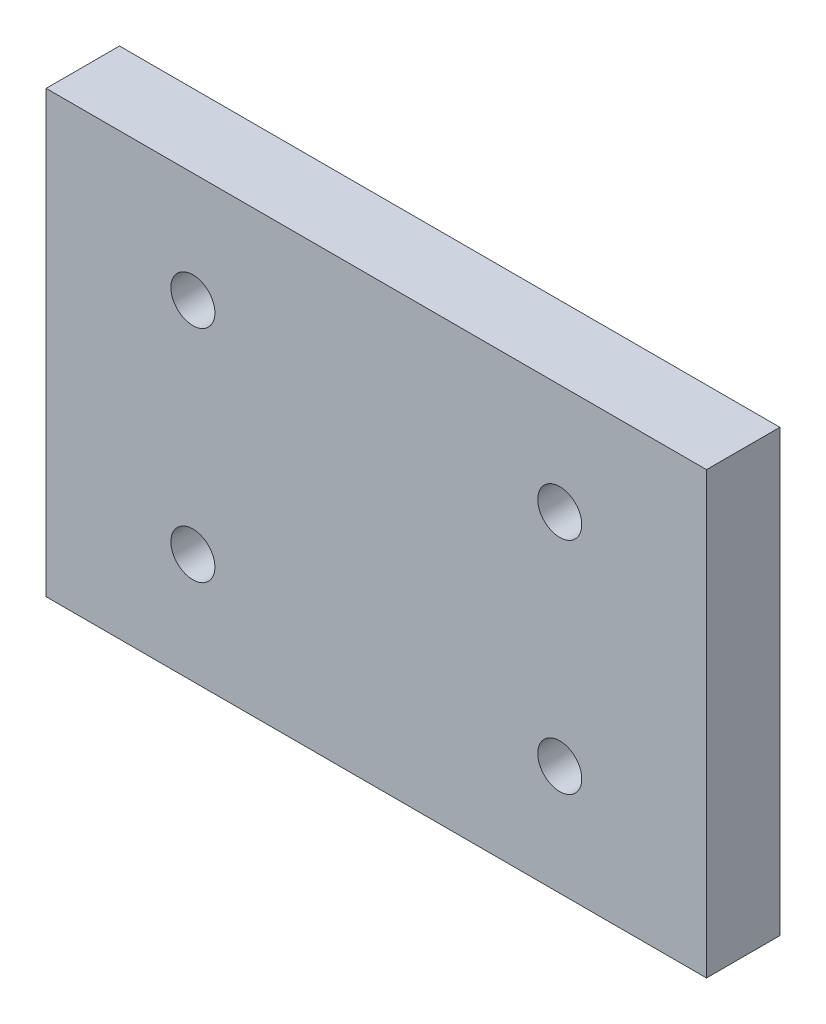
ISO-10303-21;
HEADER;
FILE_DESCRIPTION(('STEP AP214'),'2;1');
FILE_NAME('part.step','',(''),(''),'','','');
FILE_SCHEMA(('AUTOMOTIVE_DESIGN { 1 0 10303 214 1 1 1 1 }'));
ENDSEC;
DATA;
#1=APPLICATION_CONTEXT('core data for automotive mechanical design processes');
#2=APPLICATION_PROTOCOL_DEFINITION('international standard','automotive_design',2000,#1);
#3=PRODUCT_CONTEXT('',#1,'mechanical');
#4=PRODUCT('Part','Part','',(#3));
#5=PRODUCT_RELATED_PRODUCT_CATEGORY('part','',(#4));
#6=PRODUCT_DEFINITION_FORMATION('','',#4);
#7=PRODUCT_DEFINITION_CONTEXT('part definition',#1,'design');
#8=PRODUCT_DEFINITION('design','',#6,#7);
#9=PRODUCT_DEFINITION_SHAPE('','',#8);
#10=(LENGTH_UNIT() NAMED_UNIT(*) SI_UNIT(.MILLI.,.METRE.));
#11=(NAMED_UNIT(*) PLANE_ANGLE_UNIT() SI_UNIT($,.RADIAN.));
#12=(NAMED_UNIT(*) SI_UNIT($,.STERADIAN.) SOLID_ANGLE_UNIT());
#13=UNCERTAINTY_MEASURE_WITH_UNIT(LENGTH_MEASURE(1.E-05),#10,'distance_accuracy_value','');
#14=(GEOMETRIC_REPRESENTATION_CONTEXT(3) GLOBAL_UNCERTAINTY_ASSIGNED_CONTEXT((#13)) GLOBAL_UNIT_ASSIGNED_CONTEXT((#10,
#11,#12)) REPRESENTATION_CONTEXT('',''));
#15=CARTESIAN_POINT('',(0.,0.,0.));
#16=DIRECTION('',(0.,0.,1.));
#17=DIRECTION('',(1.,0.,0.));
#18=AXIS2_PLACEMENT_3D('',#15,#16,#17);
#19=CARTESIAN_POINT('',(90.,0.,20.));
#20=DIRECTION('',(0.,1.,0.));
#21=DIRECTION('',(-1.,0.,0.));
#22=AXIS2_PLACEMENT_3D('',#19,#20,#21);
#23=PLANE('',#22);
#24=DIRECTION('',(1.,0.,0.));
#25=VECTOR('',#24,1.);
#26=CARTESIAN_POINT('',(90.,0.,0.));
#27=LINE('',#26,#25);
#28=CARTESIAN_POINT('',(-90.,0.,0.));
#29=VERTEX_POINT('',#28);
#30=CARTESIAN_POINT('',(90.,0.,0.));
#31=VERTEX_POINT('',#30);
#32=EDGE_CURVE('E103',#29,#31,#27,.T.);
#33=ORIENTED_EDGE('',*,*,#32,.T.);
#34=DIRECTION('',(0.,0.,-1.));
#35=VECTOR('',#34,1.);
#36=CARTESIAN_POINT('',(90.,0.,20.));
#37=LINE('',#36,#35);
#38=CARTESIAN_POINT('',(90.,0.,20.));
#39=VERTEX_POINT('',#38);
#40=EDGE_CURVE('E11',#39,#31,#37,.T.);
#41=ORIENTED_EDGE('',*,*,#40,.F.);
#42=DIRECTION('',(1.,0.,0.));
#43=VECTOR('',#42,1.);
#44=CARTESIAN_POINT('',(90.,0.,20.));
#45=LINE('',#44,#43);
#46=CARTESIAN_POINT('',(-90.,0.,20.));
#47=VERTEX_POINT('',#46);
#48=EDGE_CURVE('E90',#47,#39,#45,.T.);
#49=ORIENTED_EDGE('',*,*,#48,.F.);
#50=DIRECTION('',(0.,0.,-1.));
#51=VECTOR('',#50,1.);
#52=CARTESIAN_POINT('',(-90.,0.,20.));
#53=LINE('',#52,#51);
#54=EDGE_CURVE('E99',#47,#29,#53,.T.);
#55=ORIENTED_EDGE('',*,*,#54,.T.);
#56=EDGE_LOOP('',(#33,#41,#49,#55));
#57=FACE_BOUND('',#56,.T.);
#58=ADVANCED_FACE('F37',(#57),#23,.F.);
#59=CARTESIAN_POINT('',(90.,120.,20.));
#60=DIRECTION('',(-1.,0.,0.));
#61=DIRECTION('',(0.,-1.,0.));
#62=AXIS2_PLACEMENT_3D('',#59,#60,#61);
#63=PLANE('',#62);
#64=DIRECTION('',(0.,1.,0.));
#65=VECTOR('',#64,1.);
#66=CARTESIAN_POINT('',(90.,120.,0.));
#67=LINE('',#66,#65);
#68=CARTESIAN_POINT('',(90.,120.,0.));
#69=VERTEX_POINT('',#68);
#70=EDGE_CURVE('E94',#31,#69,#67,.T.);
#71=ORIENTED_EDGE('',*,*,#70,.T.);
#72=DIRECTION('',(0.,0.,-1.));
#73=VECTOR('',#72,1.);
#74=CARTESIAN_POINT('',(90.,120.,20.));
#75=LINE('',#74,#73);
#76=CARTESIAN_POINT('',(90.,120.,20.));
#77=VERTEX_POINT('',#76);
#78=EDGE_CURVE('E46',#77,#69,#75,.T.);
#79=ORIENTED_EDGE('',*,*,#78,.F.);
#80=DIRECTION('',(0.,1.,0.));
#81=VECTOR('',#80,1.);
#82=CARTESIAN_POINT('',(90.,120.,20.));
#83=LINE('',#82,#81);
#84=EDGE_CURVE('E85',#39,#77,#83,.T.);
#85=ORIENTED_EDGE('',*,*,#84,.F.);
#86=ORIENTED_EDGE('',*,*,#40,.T.);
#87=EDGE_LOOP('',(#71,#79,#85,#86));
#88=FACE_BOUND('',#87,.T.);
#89=ADVANCED_FACE('F93',(#88),#63,.F.);
#90=CARTESIAN_POINT('',(-90.,120.,20.));
#91=DIRECTION('',(0.,-1.,0.));
#92=DIRECTION('',(0.,0.,-1.));
#93=AXIS2_PLACEMENT_3D('',#90,#91,#92);
#94=PLANE('',#93);
#95=DIRECTION('',(-1.,0.,0.));
#96=VECTOR('',#95,1.);
#97=CARTESIAN_POINT('',(-90.,120.,0.));
#98=LINE('',#97,#96);
#99=CARTESIAN_POINT('',(-90.,120.,0.));
#100=VERTEX_POINT('',#99);
#101=EDGE_CURVE('E72',#69,#100,#98,.T.);
#102=ORIENTED_EDGE('',*,*,#101,.T.);
#103=DIRECTION('',(0.,0.,-1.));
#104=VECTOR('',#103,1.);
#105=CARTESIAN_POINT('',(-90.,120.,20.));
#106=LINE('',#105,#104);
#107=CARTESIAN_POINT('',(-90.,120.,20.));
#108=VERTEX_POINT('',#107);
#109=EDGE_CURVE('E95',#108,#100,#106,.T.);
#110=ORIENTED_EDGE('',*,*,#109,.F.);
#111=DIRECTION('',(-1.,0.,0.));
#112=VECTOR('',#111,1.);
#113=CARTESIAN_POINT('',(-90.,120.,20.));
#114=LINE('',#113,#112);
#115=EDGE_CURVE('E88',#77,#108,#114,.T.);
#116=ORIENTED_EDGE('',*,*,#115,.F.);
#117=ORIENTED_EDGE('',*,*,#78,.T.);
#118=EDGE_LOOP('',(#102,#110,#116,#117));
#119=FACE_BOUND('',#118,.T.);
#120=ADVANCED_FACE('F97',(#119),#94,.F.);
#121=CARTESIAN_POINT('',(-90.,0.,20.));
#122=DIRECTION('',(1.,0.,0.));
#123=DIRECTION('',(0.,1.,0.));
#124=AXIS2_PLACEMENT_3D('',#121,#122,#123);
#125=PLANE('',#124);
#126=DIRECTION('',(0.,-1.,0.));
#127=VECTOR('',#126,1.);
#128=CARTESIAN_POINT('',(-90.,0.,0.));
#129=LINE('',#128,#127);
#130=EDGE_CURVE('E78',#100,#29,#129,.T.);
#131=ORIENTED_EDGE('',*,*,#130,.T.);
#132=ORIENTED_EDGE('',*,*,#54,.F.);
#133=DIRECTION('',(0.,-1.,0.));
#134=VECTOR('',#133,1.);
#135=CARTESIAN_POINT('',(-90.,0.,20.));
#136=LINE('',#135,#134);
#137=EDGE_CURVE('E55',#108,#47,#136,.T.);
#138=ORIENTED_EDGE('',*,*,#137,.F.);
#139=ORIENTED_EDGE('',*,*,#109,.T.);
#140=EDGE_LOOP('',(#131,#132,#138,#139));
#141=FACE_BOUND('',#140,.T.);
#142=ADVANCED_FACE('F139',(#141),#125,.F.);
#143=CARTESIAN_POINT('',(0.,0.,20.));
#144=DIRECTION('',(0.,0.,-1.));
#145=DIRECTION('',(-1.,0.,0.));
#146=AXIS2_PLACEMENT_3D('',#143,#144,#145);
#147=PLANE('',#146);
#148=CARTESIAN_POINT('',(-50.,90.,20.));
#149=DIRECTION('',(0.,0.,-1.));
#150=DIRECTION('',(1.,0.,0.));
#151=AXIS2_PLACEMENT_3D('',#148,#149,#150);
#152=CIRCLE('',#151,6.00000000000001);
#153=CARTESIAN_POINT('',(-44.,90.,20.));
#154=VERTEX_POINT('',#153);
#155=EDGE_CURVE('E247',#154,#154,#152,.T.);
#156=ORIENTED_EDGE('',*,*,#155,.T.);
#157=EDGE_LOOP('',(#156));
#158=FACE_BOUND('',#157,.T.);
#159=CARTESIAN_POINT('',(-50.,30.,20.));
#160=DIRECTION('',(0.,0.,-1.));
#161=DIRECTION('',(1.,0.,0.));
#162=AXIS2_PLACEMENT_3D('',#159,#160,#161);
#163=CIRCLE('',#162,6.);
#164=CARTESIAN_POINT('',(-44.,30.,20.));
#165=VERTEX_POINT('',#164);
#166=EDGE_CURVE('E244',#165,#165,#163,.T.);
#167=ORIENTED_EDGE('',*,*,#166,.T.);
#168=EDGE_LOOP('',(#167));
#169=FACE_BOUND('',#168,.T.);
#170=CARTESIAN_POINT('',(50.,30.,20.));
#171=DIRECTION('',(0.,0.,-1.));
#172=DIRECTION('',(-1.,0.,0.));
#173=AXIS2_PLACEMENT_3D('',#170,#171,#172);
#174=CIRCLE('',#173,6.);
#175=CARTESIAN_POINT('',(44.,30.,20.));
#176=VERTEX_POINT('',#175);
#177=EDGE_CURVE('E246',#176,#176,#174,.T.);
#178=ORIENTED_EDGE('',*,*,#177,.T.);
#179=EDGE_LOOP('',(#178));
#180=FACE_BOUND('',#179,.T.);
#181=CARTESIAN_POINT('',(50.,90.,20.));
#182=DIRECTION('',(0.,0.,-1.));
#183=DIRECTION('',(-1.,0.,0.));
#184=AXIS2_PLACEMENT_3D('',#181,#182,#183);
#185=CIRCLE('',#184,6.00000000000001);
#186=CARTESIAN_POINT('',(44.,90.,20.));
#187=VERTEX_POINT('',#186);
#188=EDGE_CURVE('E115',#187,#187,#185,.T.);
#189=ORIENTED_EDGE('',*,*,#188,.T.);
#190=EDGE_LOOP('',(#189));
#191=FACE_BOUND('',#190,.T.);
#192=ORIENTED_EDGE('',*,*,#48,.T.);
#193=ORIENTED_EDGE('',*,*,#84,.T.);
#194=ORIENTED_EDGE('',*,*,#115,.T.);
#195=ORIENTED_EDGE('',*,*,#137,.T.);
#196=EDGE_LOOP('',(#192,#193,#194,#195));
#197=FACE_BOUND('',#196,.T.);
#198=ADVANCED_FACE('F86',(#158,#169,#180,#191,#197),#147,.F.);
#199=CARTESIAN_POINT('',(0.,0.,0.));
#200=DIRECTION('',(0.,0.,-1.));
#201=DIRECTION('',(-1.,0.,0.));
#202=AXIS2_PLACEMENT_3D('',#199,#200,#201);
#203=PLANE('',#202);
#204=CARTESIAN_POINT('',(-50.,90.,0.));
#205=DIRECTION('',(0.,0.,-1.));
#206=DIRECTION('',(-1.,0.,0.));
#207=AXIS2_PLACEMENT_3D('',#204,#205,#206);
#208=CIRCLE('',#207,6.00000000000001);
#209=CARTESIAN_POINT('',(-56.,90.,0.));
#210=VERTEX_POINT('',#209);
#211=EDGE_CURVE('E40',#210,#210,#208,.T.);
#212=ORIENTED_EDGE('',*,*,#211,.F.);
#213=EDGE_LOOP('',(#212));
#214=FACE_BOUND('',#213,.T.);
#215=CARTESIAN_POINT('',(-50.,30.,0.));
#216=DIRECTION('',(0.,0.,-1.));
#217=DIRECTION('',(-1.,0.,0.));
#218=AXIS2_PLACEMENT_3D('',#215,#216,#217);
#219=CIRCLE('',#218,6.);
#220=CARTESIAN_POINT('',(-56.,30.,0.));
#221=VERTEX_POINT('',#220);
#222=EDGE_CURVE('E117',#221,#221,#219,.T.);
#223=ORIENTED_EDGE('',*,*,#222,.F.);
#224=EDGE_LOOP('',(#223));
#225=FACE_BOUND('',#224,.T.);
#226=CARTESIAN_POINT('',(50.,30.,0.));
#227=DIRECTION('',(0.,0.,-1.));
#228=DIRECTION('',(-1.,0.,0.));
#229=AXIS2_PLACEMENT_3D('',#226,#227,#228);
#230=CIRCLE('',#229,6.);
#231=CARTESIAN_POINT('',(44.,30.,0.));
#232=VERTEX_POINT('',#231);
#233=EDGE_CURVE('E114',#232,#232,#230,.T.);
#234=ORIENTED_EDGE('',*,*,#233,.F.);
#235=EDGE_LOOP('',(#234));
#236=FACE_BOUND('',#235,.T.);
#237=CARTESIAN_POINT('',(50.,90.,0.));
#238=DIRECTION('',(0.,0.,-1.));
#239=DIRECTION('',(-1.,0.,0.));
#240=AXIS2_PLACEMENT_3D('',#237,#238,#239);
#241=CIRCLE('',#240,6.00000000000001);
#242=CARTESIAN_POINT('',(44.,90.,0.));
#243=VERTEX_POINT('',#242);
#244=EDGE_CURVE('E111',#243,#243,#241,.T.);
#245=ORIENTED_EDGE('',*,*,#244,.F.);
#246=EDGE_LOOP('',(#245));
#247=FACE_BOUND('',#246,.T.);
#248=ORIENTED_EDGE('',*,*,#32,.F.);
#249=ORIENTED_EDGE('',*,*,#130,.F.);
#250=ORIENTED_EDGE('',*,*,#101,.F.);
#251=ORIENTED_EDGE('',*,*,#70,.F.);
#252=EDGE_LOOP('',(#248,#249,#250,#251));
#253=FACE_BOUND('',#252,.T.);
#254=ADVANCED_FACE('F127',(#214,#225,#236,#247,#253),#203,.T.);
#255=CARTESIAN_POINT('',(50.,90.,20.));
#256=DIRECTION('',(0.,0.,-1.));
#257=DIRECTION('',(-1.,0.,0.));
#258=AXIS2_PLACEMENT_3D('',#255,#256,#257);
#259=CYLINDRICAL_SURFACE('',#258,6.00000000000001);
#260=ORIENTED_EDGE('',*,*,#244,.T.);
#261=EDGE_LOOP('',(#260));
#262=FACE_BOUND('',#261,.T.);
#263=ORIENTED_EDGE('',*,*,#188,.F.);
#264=EDGE_LOOP('',(#263));
#265=FACE_BOUND('',#264,.T.);
#266=ADVANCED_FACE('F130',(#262,#265),#259,.F.);
#267=CARTESIAN_POINT('',(50.,30.,20.));
#268=DIRECTION('',(0.,0.,-1.));
#269=DIRECTION('',(-1.,0.,0.));
#270=AXIS2_PLACEMENT_3D('',#267,#268,#269);
#271=CYLINDRICAL_SURFACE('',#270,6.);
#272=ORIENTED_EDGE('',*,*,#233,.T.);
#273=EDGE_LOOP('',(#272));
#274=FACE_BOUND('',#273,.T.);
#275=ORIENTED_EDGE('',*,*,#177,.F.);
#276=EDGE_LOOP('',(#275));
#277=FACE_BOUND('',#276,.T.);
#278=ADVANCED_FACE('F188',(#274,#277),#271,.F.);
#279=CARTESIAN_POINT('',(-50.,30.,20.));
#280=DIRECTION('',(0.,0.,-1.));
#281=DIRECTION('',(-1.,0.,0.));
#282=AXIS2_PLACEMENT_3D('',#279,#280,#281);
#283=CYLINDRICAL_SURFACE('',#282,6.);
#284=ORIENTED_EDGE('',*,*,#222,.T.);
#285=EDGE_LOOP('',(#284));
#286=FACE_BOUND('',#285,.T.);
#287=ORIENTED_EDGE('',*,*,#166,.F.);
#288=EDGE_LOOP('',(#287));
#289=FACE_BOUND('',#288,.T.);
#290=ADVANCED_FACE('F199',(#286,#289),#283,.F.);
#291=CARTESIAN_POINT('',(-50.,90.,20.));
#292=DIRECTION('',(0.,0.,-1.));
#293=DIRECTION('',(-1.,0.,0.));
#294=AXIS2_PLACEMENT_3D('',#291,#292,#293);
#295=CYLINDRICAL_SURFACE('',#294,6.00000000000001);
#296=ORIENTED_EDGE('',*,*,#211,.T.);
#297=EDGE_LOOP('',(#296));
#298=FACE_BOUND('',#297,.T.);
#299=ORIENTED_EDGE('',*,*,#155,.F.);
#300=EDGE_LOOP('',(#299));
#301=FACE_BOUND('',#300,.T.);
#302=ADVANCED_FACE('F124',(#298,#301),#295,.F.);
#303=CLOSED_SHELL('',(#58,#89,#120,#142,#198,#254,#266,#278,#290,#302));
#304=MANIFOLD_SOLID_BREP('B2',#303);
#305=ADVANCED_BREP_SHAPE_REPRESENTATION('',(#18,#304),#14);
#306=SHAPE_DEFINITION_REPRESENTATION(#9,#305);
ENDSEC;
END-ISO-10303-21;
